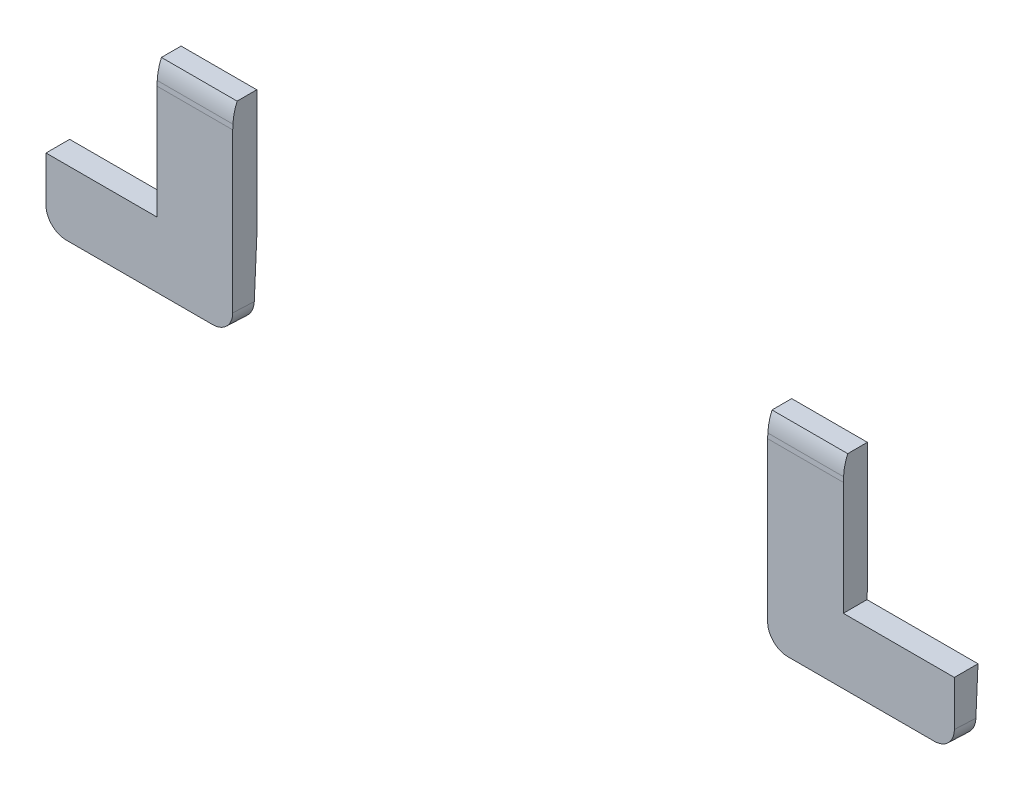
ISO-10303-21;
HEADER;
FILE_DESCRIPTION(('STEP AP214'),'2;1');
FILE_NAME('part.step','',(''),(''),'','','');
FILE_SCHEMA(('AUTOMOTIVE_DESIGN { 1 0 10303 214 1 1 1 1 }'));
ENDSEC;
DATA;
#1=APPLICATION_CONTEXT('core data for automotive mechanical design processes');
#2=APPLICATION_PROTOCOL_DEFINITION('international standard','automotive_design',2000,#1);
#3=PRODUCT_CONTEXT('',#1,'mechanical');
#4=PRODUCT('Part','Part','',(#3));
#5=PRODUCT_RELATED_PRODUCT_CATEGORY('part','',(#4));
#6=PRODUCT_DEFINITION_FORMATION('','',#4);
#7=PRODUCT_DEFINITION_CONTEXT('part definition',#1,'design');
#8=PRODUCT_DEFINITION('design','',#6,#7);
#9=PRODUCT_DEFINITION_SHAPE('','',#8);
#10=(LENGTH_UNIT() NAMED_UNIT(*) SI_UNIT(.MILLI.,.METRE.));
#11=(NAMED_UNIT(*) PLANE_ANGLE_UNIT() SI_UNIT($,.RADIAN.));
#12=(NAMED_UNIT(*) SI_UNIT($,.STERADIAN.) SOLID_ANGLE_UNIT());
#13=UNCERTAINTY_MEASURE_WITH_UNIT(LENGTH_MEASURE(1.E-05),#10,'distance_accuracy_value','');
#14=(GEOMETRIC_REPRESENTATION_CONTEXT(3) GLOBAL_UNCERTAINTY_ASSIGNED_CONTEXT((#13)) GLOBAL_UNIT_ASSIGNED_CONTEXT((#10,
#11,#12)) REPRESENTATION_CONTEXT('',''));
#15=CARTESIAN_POINT('',(0.,0.,0.));
#16=DIRECTION('',(0.,0.,1.));
#17=DIRECTION('',(1.,0.,0.));
#18=AXIS2_PLACEMENT_3D('',#15,#16,#17);
#19=CARTESIAN_POINT('',(-0.004529647218293,0.945256113519,1.630794230925));
#20=DIRECTION('',(0.,0.,1.));
#21=DIRECTION('',(1.,0.,0.));
#22=AXIS2_PLACEMENT_3D('',#19,#20,#21);
#23=PLANE('',#22);
#24=DIRECTION('',(1.,0.,0.));
#25=VECTOR('',#24,1.);
#26=CARTESIAN_POINT('',(-1.7,0.869994434825,1.630794232952));
#27=LINE('',#26,#25);
#28=CARTESIAN_POINT('',(-1.700000000121,0.869994434488,1.630794230925));
#29=VERTEX_POINT('',#28);
#30=CARTESIAN_POINT('',(-1.325,0.86999443497,1.630794233823));
#31=VERTEX_POINT('',#30);
#32=EDGE_CURVE('P0_E220',#29,#31,#27,.T.);
#33=ORIENTED_EDGE('',*,*,#32,.F.);
#34=DIRECTION('',(0.,1.,0.));
#35=VECTOR('',#34,1.);
#36=CARTESIAN_POINT('',(-1.700000000121,0.693878056689,1.630794230925));
#37=LINE('',#36,#35);
#38=CARTESIAN_POINT('',(-1.700000000121,1.5,1.630794230925));
#39=VERTEX_POINT('',#38);
#40=EDGE_CURVE('P0_E118',#29,#39,#37,.T.);
#41=ORIENTED_EDGE('',*,*,#40,.T.);
#42=DIRECTION('',(1.,0.,0.));
#43=VECTOR('',#42,1.);
#44=CARTESIAN_POINT('',(0.722735176391,1.5,1.630794230925));
#45=LINE('',#44,#43);
#46=CARTESIAN_POINT('',(-1.325,1.5,1.630794230925));
#47=VERTEX_POINT('',#46);
#48=EDGE_CURVE('P0_E204',#39,#47,#45,.T.);
#49=ORIENTED_EDGE('',*,*,#48,.T.);
#50=DIRECTION('',(0.,-1.,0.));
#51=VECTOR('',#50,1.);
#52=CARTESIAN_POINT('',(-1.325,1.305636250759,1.630794230925));
#53=LINE('',#52,#51);
#54=EDGE_CURVE('P0_E215',#47,#31,#53,.T.);
#55=ORIENTED_EDGE('',*,*,#54,.T.);
#56=EDGE_LOOP('',(#33,#41,#49,#55));
#57=FACE_BOUND('',#56,.T.);
#58=ADVANCED_FACE('P0_F16',(#57),#23,.F.);
#59=CARTESIAN_POINT('',(-2.391207098215,0.825845048784,1.75));
#60=DIRECTION('',(0.,1.,0.));
#61=DIRECTION('',(1.,0.,0.));
#62=AXIS2_PLACEMENT_3D('',#59,#60,#61);
#63=PLANE('',#62);
#64=DIRECTION('',(0.,0.,1.));
#65=VECTOR('',#64,1.);
#66=CARTESIAN_POINT('',(-2.25,0.825845048784,1.6988636365));
#67=LINE('',#66,#65);
#68=CARTESIAN_POINT('',(-2.25,0.825845048784,1.632801024034));
#69=VERTEX_POINT('',#68);
#70=CARTESIAN_POINT('',(-2.25,0.825845048784,1.75));
#71=VERTEX_POINT('',#70);
#72=EDGE_CURVE('P0_E11',#69,#71,#67,.T.);
#73=ORIENTED_EDGE('',*,*,#72,.T.);
#74=DIRECTION('',(1.,0.,0.));
#75=VECTOR('',#74,1.);
#76=CARTESIAN_POINT('',(-2.370603549108,0.825845048784,1.75));
#77=LINE('',#76,#75);
#78=CARTESIAN_POINT('',(-1.700000000121,0.825845048784,1.75));
#79=VERTEX_POINT('',#78);
#80=EDGE_CURVE('P0_E166',#71,#79,#77,.T.);
#81=ORIENTED_EDGE('',*,*,#80,.T.);
#82=DIRECTION('',(0.,0.,1.));
#83=VECTOR('',#82,1.);
#84=CARTESIAN_POINT('',(-1.700000000121,0.825845048784,1.75));
#85=LINE('',#84,#83);
#86=CARTESIAN_POINT('',(-1.700000000121,0.825845048784,1.632801024034));
#87=VERTEX_POINT('',#86);
#88=EDGE_CURVE('P0_E152',#87,#79,#85,.T.);
#89=ORIENTED_EDGE('',*,*,#88,.F.);
#90=DIRECTION('',(-1.,0.,0.));
#91=VECTOR('',#90,1.);
#92=CARTESIAN_POINT('',(-1.858103549108,0.825845048784,1.632801024034));
#93=LINE('',#92,#91);
#94=EDGE_CURVE('P0_E235',#87,#69,#93,.T.);
#95=ORIENTED_EDGE('',*,*,#94,.T.);
#96=EDGE_LOOP('',(#73,#81,#89,#95));
#97=FACE_BOUND('',#96,.T.);
#98=ADVANCED_FACE('P0_F167',(#97),#63,.T.);
#99=CARTESIAN_POINT('',(-2.25,0.49746756,1.647727273));
#100=DIRECTION('',(1.,0.,0.));
#101=DIRECTION('',(0.,0.,1.));
#102=AXIS2_PLACEMENT_3D('',#99,#100,#101);
#103=PLANE('',#102);
#104=ORIENTED_EDGE('',*,*,#72,.F.);
#105=DIRECTION('',(0.,0.998968540282601,-0.0454076593280119));
#106=VECTOR('',#105,1.);
#107=CARTESIAN_POINT('',(-2.25,0.49746756,1.647727273));
#108=LINE('',#107,#106);
#109=CARTESIAN_POINT('',(-2.25,0.597364413256,1.643186507102));
#110=VERTEX_POINT('',#109);
#111=EDGE_CURVE('P0_E27',#110,#69,#108,.T.);
#112=ORIENTED_EDGE('',*,*,#111,.F.);
#113=DIRECTION('',(0.,0.0454076593280119,0.998968540282601));
#114=VECTOR('',#113,1.);
#115=CARTESIAN_POINT('',(-2.25,0.597364413256,1.643186507102));
#116=LINE('',#115,#114);
#117=CARTESIAN_POINT('',(-2.25,0.602219571853,1.75));
#118=VERTEX_POINT('',#117);
#119=EDGE_CURVE('P0_E243',#110,#118,#116,.T.);
#120=ORIENTED_EDGE('',*,*,#119,.T.);
#121=DIRECTION('',(0.,1.,0.));
#122=VECTOR('',#121,1.);
#123=CARTESIAN_POINT('',(-2.25,0.668095740128,1.75));
#124=LINE('',#123,#122);
#125=EDGE_CURVE('P0_E170',#118,#71,#124,.T.);
#126=ORIENTED_EDGE('',*,*,#125,.T.);
#127=EDGE_LOOP('',(#104,#112,#120,#126));
#128=FACE_BOUND('',#127,.T.);
#129=ADVANCED_FACE('P0_F329',(#128),#103,.F.);
#130=CARTESIAN_POINT('',(-1.325,0.49746756,1.647727273));
#131=DIRECTION('',(0.,0.0454076593280119,0.998968540282601));
#132=DIRECTION('',(1.,0.,0.));
#133=AXIS2_PLACEMENT_3D('',#130,#131,#132);
#134=PLANE('',#133);
#135=ORIENTED_EDGE('',*,*,#94,.F.);
#136=DIRECTION('',(0.,-0.998968540282601,0.0454076593280119));
#137=VECTOR('',#136,1.);
#138=CARTESIAN_POINT('',(-1.700000000121,0.467720859972,1.649079395681));
#139=LINE('',#138,#137);
#140=EDGE_CURVE('P0_E159',#29,#87,#139,.T.);
#141=ORIENTED_EDGE('',*,*,#140,.F.);
#142=ORIENTED_EDGE('',*,*,#32,.T.);
#143=DIRECTION('',(0.,0.998968540282601,-0.0454076593280119));
#144=VECTOR('',#143,1.);
#145=CARTESIAN_POINT('',(-1.325,0.49746756,1.647727273));
#146=LINE('',#145,#144);
#147=CARTESIAN_POINT('',(-1.325,0.597364413256,1.643186507102));
#148=VERTEX_POINT('',#147);
#149=EDGE_CURVE('P0_E84',#148,#31,#146,.T.);
#150=ORIENTED_EDGE('',*,*,#149,.F.);
#151=CARTESIAN_POINT('',(-1.424999999226,0.597364413256,1.643186507102));
#152=DIRECTION('',(0.,-0.0454076593280117,-0.998968540282601));
#153=DIRECTION('',(0.,-0.998968540282601,0.0454076593280117));
#154=AXIS2_PLACEMENT_3D('',#151,#152,#153);
#155=CIRCLE('',#154,0.09999999922649);
#156=CARTESIAN_POINT('',(-1.424999999226,0.49746756,1.647727273));
#157=VERTEX_POINT('',#156);
#158=EDGE_CURVE('P0_E143',#148,#157,#155,.T.);
#159=ORIENTED_EDGE('',*,*,#158,.T.);
#160=DIRECTION('',(1.,0.,0.));
#161=VECTOR('',#160,1.);
#162=CARTESIAN_POINT('',(-1.325,0.49746756,1.647727273));
#163=LINE('',#162,#161);
#164=CARTESIAN_POINT('',(-2.150000000774,0.49746756,1.647727273));
#165=VERTEX_POINT('',#164);
#166=EDGE_CURVE('P0_E184',#165,#157,#163,.T.);
#167=ORIENTED_EDGE('',*,*,#166,.F.);
#168=CARTESIAN_POINT('',(-2.150000000774,0.597364413256,1.643186507102));
#169=DIRECTION('',(0.,-0.0454076593280117,-0.998968540282601));
#170=DIRECTION('',(0.,-0.998968540282601,0.0454076593280117));
#171=AXIS2_PLACEMENT_3D('',#168,#169,#170);
#172=CIRCLE('',#171,0.09999999922649);
#173=EDGE_CURVE('P0_E239',#165,#110,#172,.T.);
#174=ORIENTED_EDGE('',*,*,#173,.T.);
#175=ORIENTED_EDGE('',*,*,#111,.T.);
#176=EDGE_LOOP('',(#135,#141,#142,#150,#159,#167,#174,#175));
#177=FACE_BOUND('',#176,.T.);
#178=ADVANCED_FACE('P0_F296',(#177),#134,.F.);
#179=CARTESIAN_POINT('',(1.325,1.363023706,1.751119625));
#180=DIRECTION('',(0.,0.0454076614461347,0.998968540186323));
#181=DIRECTION('',(1.,0.,0.));
#182=AXIS2_PLACEMENT_3D('',#179,#180,#181);
#183=PLANE('',#182);
#184=DIRECTION('',(1.,0.,0.));
#185=VECTOR('',#184,1.);
#186=CARTESIAN_POINT('',(-0.501966381464,1.387655455713,1.75));
#187=LINE('',#186,#185);
#188=CARTESIAN_POINT('',(-1.699999999587,1.387655455713,1.75));
#189=VERTEX_POINT('',#188);
#190=CARTESIAN_POINT('',(-1.325,1.387655455713,1.75));
#191=VERTEX_POINT('',#190);
#192=EDGE_CURVE('P0_E175',#189,#191,#187,.T.);
#193=ORIENTED_EDGE('',*,*,#192,.T.);
#194=DIRECTION('',(0.,0.998968540186323,-0.0454076614461347));
#195=VECTOR('',#194,1.);
#196=CARTESIAN_POINT('',(-1.325,1.363023706,1.751119625));
#197=LINE('',#196,#195);
#198=CARTESIAN_POINT('',(-1.325,1.411408062362,1.748920336049));
#199=VERTEX_POINT('',#198);
#200=EDGE_CURVE('P0_E98',#191,#199,#197,.T.);
#201=ORIENTED_EDGE('',*,*,#200,.T.);
#202=DIRECTION('',(-1.,0.,0.));
#203=VECTOR('',#202,1.);
#204=CARTESIAN_POINT('',(1.325,1.411408062362,1.748920336049));
#205=LINE('',#204,#203);
#206=CARTESIAN_POINT('',(-1.699999999587,1.411408062362,1.748920336049));
#207=VERTEX_POINT('',#206);
#208=EDGE_CURVE('P0_E163',#199,#207,#205,.T.);
#209=ORIENTED_EDGE('',*,*,#208,.T.);
#210=DIRECTION('',(0.,-0.998968540186323,0.0454076614461347));
#211=VECTOR('',#210,1.);
#212=CARTESIAN_POINT('',(-1.699999999587,1.363023706,1.751119625));
#213=LINE('',#212,#211);
#214=EDGE_CURVE('P0_E20',#207,#189,#213,.T.);
#215=ORIENTED_EDGE('',*,*,#214,.T.);
#216=EDGE_LOOP('',(#193,#201,#209,#215));
#217=FACE_BOUND('',#216,.T.);
#218=ADVANCED_FACE('P0_F18',(#217),#183,.T.);
#219=CARTESIAN_POINT('',(-1.325,1.666016388,1.55));
#220=DIRECTION('',(1.,0.,0.));
#221=DIRECTION('',(0.,1.,0.));
#222=AXIS2_PLACEMENT_3D('',#219,#220,#221);
#223=PLANE('',#222);
#224=ORIENTED_EDGE('',*,*,#54,.F.);
#225=DIRECTION('',(0.,0.,1.));
#226=VECTOR('',#225,1.);
#227=CARTESIAN_POINT('',(-1.325,1.5,0.655278002348));
#228=LINE('',#227,#226);
#229=CARTESIAN_POINT('',(-1.325,1.5,1.728331482121));
#230=VERTEX_POINT('',#229);
#231=EDGE_CURVE('P0_E192',#47,#230,#228,.T.);
#232=ORIENTED_EDGE('',*,*,#231,.T.);
#233=CARTESIAN_POINT('',(-1.325,1.400056147,1.499178201002));
#234=DIRECTION('',(1.,0.,0.));
#235=DIRECTION('',(0.,0.,-1.));
#236=AXIS2_PLACEMENT_3D('',#233,#234,#235);
#237=CIRCLE('',#236,0.25);
#238=EDGE_CURVE('P0_E218',#230,#199,#237,.T.);
#239=ORIENTED_EDGE('',*,*,#238,.T.);
#240=ORIENTED_EDGE('',*,*,#200,.F.);
#241=DIRECTION('',(0.,-1.,0.));
#242=VECTOR('',#241,1.);
#243=CARTESIAN_POINT('',(-1.325,1.252370154128,1.75));
#244=LINE('',#243,#242);
#245=CARTESIAN_POINT('',(-1.325,0.602219571853,1.75));
#246=VERTEX_POINT('',#245);
#247=EDGE_CURVE('P0_E210',#191,#246,#244,.T.);
#248=ORIENTED_EDGE('',*,*,#247,.T.);
#249=DIRECTION('',(0.,-0.0454076593280119,-0.998968540282601));
#250=VECTOR('',#249,1.);
#251=CARTESIAN_POINT('',(-1.325,0.597364413256,1.643186507102));
#252=LINE('',#251,#250);
#253=EDGE_CURVE('P0_E248',#246,#148,#252,.T.);
#254=ORIENTED_EDGE('',*,*,#253,.T.);
#255=ORIENTED_EDGE('',*,*,#149,.T.);
#256=EDGE_LOOP('',(#224,#232,#239,#240,#248,#254,#255));
#257=FACE_BOUND('',#256,.T.);
#258=ADVANCED_FACE('P0_F278',(#257),#223,.T.);
#259=CARTESIAN_POINT('',(-1.424999999226,0.603839027256,1.785628020102));
#260=DIRECTION('',(0.,-0.0454076593280117,-0.998968540282601));
#261=DIRECTION('',(0.,0.998968540282601,-0.0454076593280117));
#262=AXIS2_PLACEMENT_3D('',#259,#260,#261);
#263=CYLINDRICAL_SURFACE('',#262,0.09999999922649);
#264=CARTESIAN_POINT('',(-1.325,0.602219571853,1.75));
#265=CARTESIAN_POINT('',(-1.32499999999951,0.543580444645959,1.75));
#266=CARTESIAN_POINT('',(-1.36642135591642,0.502116320155,1.75));
#267=CARTESIAN_POINT('',(-1.424999999226,0.502116320155,1.75));
#268=(BOUNDED_CURVE() B_SPLINE_CURVE(3,(#264,#265,#266,#267),.UNSPECIFIED.,.F.,
.F.) B_SPLINE_CURVE_WITH_KNOTS((4,4),(1.5707963267949,3.1415926535898),
.UNSPECIFIED.) CURVE() GEOMETRIC_REPRESENTATION_ITEM() RATIONAL_B_SPLINE_CURVE((1.,
0.804737854124365,0.804737854124365,1.)) REPRESENTATION_ITEM(''));
#269=CARTESIAN_POINT('',(-1.424999999226,0.502116320155,1.75));
#270=VERTEX_POINT('',#269);
#271=EDGE_CURVE('P0_E188',#246,#270,#268,.T.);
#272=ORIENTED_EDGE('',*,*,#271,.T.);
#273=DIRECTION('',(0.,0.0454076593280119,0.998968540282601));
#274=VECTOR('',#273,1.);
#275=CARTESIAN_POINT('',(-1.424999999226,0.503942174,1.790168786));
#276=LINE('',#275,#274);
#277=EDGE_CURVE('P0_E177',#157,#270,#276,.T.);
#278=ORIENTED_EDGE('',*,*,#277,.F.);
#279=ORIENTED_EDGE('',*,*,#158,.F.);
#280=ORIENTED_EDGE('',*,*,#253,.F.);
#281=EDGE_LOOP('',(#272,#278,#279,#280));
#282=FACE_BOUND('',#281,.T.);
#283=ADVANCED_FACE('P0_F281',(#282),#263,.T.);
#284=CARTESIAN_POINT('',(1.325,1.400056147,1.499178201002));
#285=DIRECTION('',(-1.,0.,0.));
#286=DIRECTION('',(0.,0.,1.));
#287=AXIS2_PLACEMENT_3D('',#284,#285,#286);
#288=CYLINDRICAL_SURFACE('',#287,0.25);
#289=DIRECTION('',(-1.,0.,0.));
#290=VECTOR('',#289,1.);
#291=CARTESIAN_POINT('',(1.325,1.5,1.728331482121));
#292=LINE('',#291,#290);
#293=CARTESIAN_POINT('',(-1.7,1.5,1.728331482121));
#294=VERTEX_POINT('',#293);
#295=EDGE_CURVE('P0_E195',#230,#294,#292,.T.);
#296=ORIENTED_EDGE('',*,*,#295,.T.);
#297=CARTESIAN_POINT('',(-1.7,1.400056147,1.499178201002));
#298=DIRECTION('',(-1.,0.,0.));
#299=DIRECTION('',(0.,0.,-1.));
#300=AXIS2_PLACEMENT_3D('',#297,#298,#299);
#301=CIRCLE('',#300,0.25);
#302=EDGE_CURVE('P0_E225',#207,#294,#301,.T.);
#303=ORIENTED_EDGE('',*,*,#302,.F.);
#304=ORIENTED_EDGE('',*,*,#208,.F.);
#305=ORIENTED_EDGE('',*,*,#238,.F.);
#306=EDGE_LOOP('',(#296,#303,#304,#305));
#307=FACE_BOUND('',#306,.T.);
#308=ADVANCED_FACE('P0_F339',(#307),#288,.T.);
#309=CARTESIAN_POINT('',(-1.7,1.499999999739,1.521793619773));
#310=DIRECTION('',(1.,0.,0.));
#311=DIRECTION('',(0.,1.,0.));
#312=AXIS2_PLACEMENT_3D('',#309,#310,#311);
#313=PLANE('',#312);
#314=DIRECTION('',(0.,1.,0.));
#315=VECTOR('',#314,1.);
#316=CARTESIAN_POINT('',(-1.7,1.169361959998,1.75));
#317=LINE('',#316,#315);
#318=EDGE_CURVE('P0_E157',#79,#189,#317,.T.);
#319=ORIENTED_EDGE('',*,*,#318,.T.);
#320=ORIENTED_EDGE('',*,*,#214,.F.);
#321=ORIENTED_EDGE('',*,*,#302,.T.);
#322=DIRECTION('',(0.,0.,-1.));
#323=VECTOR('',#322,1.);
#324=CARTESIAN_POINT('',(-1.7,1.5,0.641174812234));
#325=LINE('',#324,#323);
#326=EDGE_CURVE('P0_E206',#294,#39,#325,.T.);
#327=ORIENTED_EDGE('',*,*,#326,.T.);
#328=ORIENTED_EDGE('',*,*,#40,.F.);
#329=ORIENTED_EDGE('',*,*,#140,.T.);
#330=ORIENTED_EDGE('',*,*,#88,.T.);
#331=EDGE_LOOP('',(#319,#320,#321,#327,#328,#329,#330));
#332=FACE_BOUND('',#331,.T.);
#333=ADVANCED_FACE('P0_F154',(#332),#313,.F.);
#334=CARTESIAN_POINT('',(1.45,1.5,-1.6));
#335=DIRECTION('',(0.,1.,0.));
#336=DIRECTION('',(1.,0.,0.));
#337=AXIS2_PLACEMENT_3D('',#334,#335,#336);
#338=PLANE('',#337);
#339=ORIENTED_EDGE('',*,*,#48,.F.);
#340=ORIENTED_EDGE('',*,*,#326,.F.);
#341=ORIENTED_EDGE('',*,*,#295,.F.);
#342=ORIENTED_EDGE('',*,*,#231,.F.);
#343=EDGE_LOOP('',(#339,#340,#341,#342));
#344=FACE_BOUND('',#343,.T.);
#345=ADVANCED_FACE('P0_F277',(#344),#338,.T.);
#346=CARTESIAN_POINT('',(-2.35,0.9,1.75));
#347=DIRECTION('',(0.,0.,1.));
#348=DIRECTION('',(1.,0.,0.));
#349=AXIS2_PLACEMENT_3D('',#346,#347,#348);
#350=PLANE('',#349);
#351=ORIENTED_EDGE('',*,*,#318,.F.);
#352=ORIENTED_EDGE('',*,*,#80,.F.);
#353=ORIENTED_EDGE('',*,*,#125,.F.);
#354=CARTESIAN_POINT('',(-2.150000000774,0.502116320155,1.75));
#355=CARTESIAN_POINT('',(-2.20857864408358,0.502116320155,1.75));
#356=CARTESIAN_POINT('',(-2.25000000000049,0.543580444645959,1.75));
#357=CARTESIAN_POINT('',(-2.25,0.602219571853,1.75));
#358=(BOUNDED_CURVE() B_SPLINE_CURVE(3,(#354,#355,#356,#357),.UNSPECIFIED.,.F.,
.F.) B_SPLINE_CURVE_WITH_KNOTS((4,4),(3.1415926535898,4.71238898038469),
.UNSPECIFIED.) CURVE() GEOMETRIC_REPRESENTATION_ITEM() RATIONAL_B_SPLINE_CURVE((1.,
0.804737854124365,0.804737854124365,1.)) REPRESENTATION_ITEM(''));
#359=CARTESIAN_POINT('',(-2.150000000774,0.502116320155,1.75));
#360=VERTEX_POINT('',#359);
#361=EDGE_CURVE('P0_E247',#360,#118,#358,.T.);
#362=ORIENTED_EDGE('',*,*,#361,.F.);
#363=DIRECTION('',(-1.,0.,0.));
#364=VECTOR('',#363,1.);
#365=CARTESIAN_POINT('',(-2.289466381464,0.502116320155,1.75));
#366=LINE('',#365,#364);
#367=EDGE_CURVE('P0_E199',#270,#360,#366,.T.);
#368=ORIENTED_EDGE('',*,*,#367,.F.);
#369=ORIENTED_EDGE('',*,*,#271,.F.);
#370=ORIENTED_EDGE('',*,*,#247,.F.);
#371=ORIENTED_EDGE('',*,*,#192,.F.);
#372=EDGE_LOOP('',(#351,#352,#353,#362,#368,#369,#370,#371));
#373=FACE_BOUND('',#372,.T.);
#374=ADVANCED_FACE('P0_F173',(#373),#350,.T.);
#375=CARTESIAN_POINT('',(-2.25,0.503942174,1.790168786));
#376=DIRECTION('',(0.,0.998968540282601,-0.0454076593280119));
#377=DIRECTION('',(-1.,0.,0.));
#378=AXIS2_PLACEMENT_3D('',#375,#376,#377);
#379=PLANE('',#378);
#380=ORIENTED_EDGE('',*,*,#367,.T.);
#381=DIRECTION('',(0.,-0.0454076593280119,-0.998968540282601));
#382=VECTOR('',#381,1.);
#383=CARTESIAN_POINT('',(-2.150000000774,0.503942174,1.790168786));
#384=LINE('',#383,#382);
#385=EDGE_CURVE('P0_E203',#360,#165,#384,.T.);
#386=ORIENTED_EDGE('',*,*,#385,.T.);
#387=ORIENTED_EDGE('',*,*,#166,.T.);
#388=ORIENTED_EDGE('',*,*,#277,.T.);
#389=EDGE_LOOP('',(#380,#386,#387,#388));
#390=FACE_BOUND('',#389,.T.);
#391=ADVANCED_FACE('P0_F285',(#390),#379,.F.);
#392=CARTESIAN_POINT('',(-2.150000000774,0.603839027256,1.785628020102));
#393=DIRECTION('',(0.,-0.0454076593280117,-0.998968540282601));
#394=DIRECTION('',(0.,0.998968540282601,-0.0454076593280117));
#395=AXIS2_PLACEMENT_3D('',#392,#393,#394);
#396=CYLINDRICAL_SURFACE('',#395,0.09999999922649);
#397=ORIENTED_EDGE('',*,*,#361,.T.);
#398=ORIENTED_EDGE('',*,*,#119,.F.);
#399=ORIENTED_EDGE('',*,*,#173,.F.);
#400=ORIENTED_EDGE('',*,*,#385,.F.);
#401=EDGE_LOOP('',(#397,#398,#399,#400));
#402=FACE_BOUND('',#401,.T.);
#403=ADVANCED_FACE('P0_F365',(#402),#396,.T.);
#404=CLOSED_SHELL('',(#58,#98,#129,#178,#218,#258,#283,#308,#333,#345,#374,#391,#403));
#405=MANIFOLD_SOLID_BREP('P0_B1',#404);
#406=CARTESIAN_POINT('',(1.325,1.400056147,1.499178201002));
#407=DIRECTION('',(-1.,0.,0.));
#408=DIRECTION('',(0.,0.,1.));
#409=AXIS2_PLACEMENT_3D('',#406,#407,#408);
#410=CYLINDRICAL_SURFACE('',#409,0.25);
#411=DIRECTION('',(-1.,0.,0.));
#412=VECTOR('',#411,1.);
#413=CARTESIAN_POINT('',(1.325,1.5,1.728331482121));
#414=LINE('',#413,#412);
#415=CARTESIAN_POINT('',(1.7,1.5,1.728331482121));
#416=VERTEX_POINT('',#415);
#417=CARTESIAN_POINT('',(1.325,1.5,1.728331482121));
#418=VERTEX_POINT('',#417);
#419=EDGE_CURVE('P1_E169',#416,#418,#414,.T.);
#420=ORIENTED_EDGE('',*,*,#419,.T.);
#421=CARTESIAN_POINT('',(1.325,1.400056147,1.499178201002));
#422=DIRECTION('',(-1.,0.,0.));
#423=DIRECTION('',(0.,0.,1.));
#424=AXIS2_PLACEMENT_3D('',#421,#422,#423);
#425=CIRCLE('',#424,0.25);
#426=CARTESIAN_POINT('',(1.325000000125,1.411408062362,1.748920336049));
#427=VERTEX_POINT('',#426);
#428=EDGE_CURVE('P1_E202',#427,#418,#425,.T.);
#429=ORIENTED_EDGE('',*,*,#428,.F.);
#430=DIRECTION('',(-1.,0.,0.));
#431=VECTOR('',#430,1.);
#432=CARTESIAN_POINT('',(1.325,1.411408062362,1.748920336049));
#433=LINE('',#432,#431);
#434=CARTESIAN_POINT('',(1.7,1.411408062386,1.748920336591));
#435=VERTEX_POINT('',#434);
#436=EDGE_CURVE('P1_E196',#435,#427,#433,.T.);
#437=ORIENTED_EDGE('',*,*,#436,.F.);
#438=CARTESIAN_POINT('',(1.7,1.400056147,1.499178201002));
#439=DIRECTION('',(1.,0.,0.));
#440=DIRECTION('',(0.,0.,-1.));
#441=AXIS2_PLACEMENT_3D('',#438,#439,#440);
#442=CIRCLE('',#441,0.25);
#443=EDGE_CURVE('P1_E145',#416,#435,#442,.T.);
#444=ORIENTED_EDGE('',*,*,#443,.F.);
#445=EDGE_LOOP('',(#420,#429,#437,#444));
#446=FACE_BOUND('',#445,.T.);
#447=ADVANCED_FACE('P1_F16',(#446),#410,.T.);
#448=CARTESIAN_POINT('',(1.424999999226,0.603839027256,1.785628020102));
#449=DIRECTION('',(0.,0.0454076593280117,0.998968540282601));
#450=DIRECTION('',(0.,-0.998968540282601,0.0454076593280117));
#451=AXIS2_PLACEMENT_3D('',#448,#449,#450);
#452=CYLINDRICAL_SURFACE('',#451,0.09999999922649);
#453=CARTESIAN_POINT('',(1.424999999226,0.502116320155,1.75));
#454=CARTESIAN_POINT('',(1.36642135591642,0.502116320155,1.75));
#455=CARTESIAN_POINT('',(1.32499999999951,0.543580444645959,1.75));
#456=CARTESIAN_POINT('',(1.325,0.602219571853,1.75));
#457=(BOUNDED_CURVE() B_SPLINE_CURVE(3,(#453,#454,#455,#456),.UNSPECIFIED.,.F.,
.F.) B_SPLINE_CURVE_WITH_KNOTS((4,4),(0.,1.5707963267949),
.UNSPECIFIED.) CURVE() GEOMETRIC_REPRESENTATION_ITEM() RATIONAL_B_SPLINE_CURVE((1.,
0.804737854124365,0.804737854124365,1.)) REPRESENTATION_ITEM(''));
#458=CARTESIAN_POINT('',(1.424999999226,0.502116320155,1.75));
#459=VERTEX_POINT('',#458);
#460=CARTESIAN_POINT('',(1.325,0.602219571853,1.75));
#461=VERTEX_POINT('',#460);
#462=EDGE_CURVE('P1_E11',#459,#461,#457,.T.);
#463=ORIENTED_EDGE('',*,*,#462,.T.);
#464=DIRECTION('',(0.,0.0454076593280119,0.998968540282601));
#465=VECTOR('',#464,1.);
#466=CARTESIAN_POINT('',(1.325,0.603839027256,1.785628020102));
#467=LINE('',#466,#465);
#468=CARTESIAN_POINT('',(1.325,0.597364413256,1.643186507102));
#469=VERTEX_POINT('',#468);
#470=EDGE_CURVE('P1_E186',#469,#461,#467,.T.);
#471=ORIENTED_EDGE('',*,*,#470,.F.);
#472=CARTESIAN_POINT('',(1.424999999226,0.597364413256,1.643186507102));
#473=DIRECTION('',(0.,-0.0454076593280117,-0.998968540282601));
#474=DIRECTION('',(0.,-0.998968540282601,0.0454076593280117));
#475=AXIS2_PLACEMENT_3D('',#472,#473,#474);
#476=CIRCLE('',#475,0.09999999922649);
#477=CARTESIAN_POINT('',(1.424999999226,0.49746756,1.647727273));
#478=VERTEX_POINT('',#477);
#479=EDGE_CURVE('P1_E240',#478,#469,#476,.T.);
#480=ORIENTED_EDGE('',*,*,#479,.F.);
#481=DIRECTION('',(0.,-0.0454076593280119,-0.998968540282601));
#482=VECTOR('',#481,1.);
#483=CARTESIAN_POINT('',(1.424999999226,0.49746756,1.647727273));
#484=LINE('',#483,#482);
#485=EDGE_CURVE('P1_E27',#459,#478,#484,.T.);
#486=ORIENTED_EDGE('',*,*,#485,.F.);
#487=EDGE_LOOP('',(#463,#471,#480,#486));
#488=FACE_BOUND('',#487,.T.);
#489=ADVANCED_FACE('P1_F425',(#488),#452,.T.);
#490=CARTESIAN_POINT('',(2.35,1.24,1.75));
#491=DIRECTION('',(0.,0.,1.));
#492=DIRECTION('',(1.,0.,0.));
#493=AXIS2_PLACEMENT_3D('',#490,#491,#492);
#494=PLANE('',#493);
#495=DIRECTION('',(0.,-1.,0.));
#496=VECTOR('',#495,1.);
#497=CARTESIAN_POINT('',(1.7,0.944702956164,1.75));
#498=LINE('',#497,#496);
#499=CARTESIAN_POINT('',(1.7,1.387655489873,1.75));
#500=VERTEX_POINT('',#499);
#501=CARTESIAN_POINT('',(1.700000000251,0.825845048784,1.75));
#502=VERTEX_POINT('',#501);
#503=EDGE_CURVE('P1_E134',#500,#502,#498,.T.);
#504=ORIENTED_EDGE('',*,*,#503,.F.);
#505=DIRECTION('',(1.,0.,0.));
#506=VECTOR('',#505,1.);
#507=CARTESIAN_POINT('',(1.620829202549,1.387655455713,1.75));
#508=LINE('',#507,#506);
#509=CARTESIAN_POINT('',(1.325000000125,1.387655455713,1.75));
#510=VERTEX_POINT('',#509);
#511=EDGE_CURVE('P1_E194',#510,#500,#508,.T.);
#512=ORIENTED_EDGE('',*,*,#511,.F.);
#513=DIRECTION('',(0.,1.,0.));
#514=VECTOR('',#513,1.);
#515=CARTESIAN_POINT('',(1.325,0.795130297368,1.75));
#516=LINE('',#515,#514);
#517=EDGE_CURVE('P1_E181',#461,#510,#516,.T.);
#518=ORIENTED_EDGE('',*,*,#517,.F.);
#519=ORIENTED_EDGE('',*,*,#462,.F.);
#520=DIRECTION('',(-1.,0.,0.));
#521=VECTOR('',#520,1.);
#522=CARTESIAN_POINT('',(1.620829202549,0.502116320155,1.75));
#523=LINE('',#522,#521);
#524=CARTESIAN_POINT('',(2.150000000707,0.502116320155,1.75));
#525=VERTEX_POINT('',#524);
#526=EDGE_CURVE('P1_E144',#525,#459,#523,.T.);
#527=ORIENTED_EDGE('',*,*,#526,.F.);
#528=CARTESIAN_POINT('',(2.249999999933,0.602219571853,1.75));
#529=CARTESIAN_POINT('',(2.24999999993349,0.543580444645959,1.75));
#530=CARTESIAN_POINT('',(2.20857864401658,0.502116320155,1.75));
#531=CARTESIAN_POINT('',(2.150000000707,0.502116320155,1.75));
#532=(BOUNDED_CURVE() B_SPLINE_CURVE(3,(#528,#529,#530,#531),.UNSPECIFIED.,.F.,
.F.) B_SPLINE_CURVE_WITH_KNOTS((4,4),(4.71238898038469,6.28318530717959),
.UNSPECIFIED.) CURVE() GEOMETRIC_REPRESENTATION_ITEM() RATIONAL_B_SPLINE_CURVE((1.,
0.804737854124365,0.804737854124365,1.)) REPRESENTATION_ITEM(''));
#533=CARTESIAN_POINT('',(2.249999999933,0.602219571853,1.75));
#534=VERTEX_POINT('',#533);
#535=EDGE_CURVE('P1_E195',#534,#525,#532,.T.);
#536=ORIENTED_EDGE('',*,*,#535,.F.);
#537=DIRECTION('',(0.,-1.,0.));
#538=VECTOR('',#537,1.);
#539=CARTESIAN_POINT('',(2.249999999933,0.9464373606,1.75));
#540=LINE('',#539,#538);
#541=CARTESIAN_POINT('',(2.249999999933,0.825845048784,1.75));
#542=VERTEX_POINT('',#541);
#543=EDGE_CURVE('P1_E150',#542,#534,#540,.T.);
#544=ORIENTED_EDGE('',*,*,#543,.F.);
#545=DIRECTION('',(1.,0.,0.));
#546=VECTOR('',#545,1.);
#547=CARTESIAN_POINT('',(1.8375,0.825845048784,1.75));
#548=LINE('',#547,#546);
#549=EDGE_CURVE('P1_E148',#502,#542,#548,.T.);
#550=ORIENTED_EDGE('',*,*,#549,.F.);
#551=EDGE_LOOP('',(#504,#512,#518,#519,#527,#536,#544,#550));
#552=FACE_BOUND('',#551,.T.);
#553=ADVANCED_FACE('P1_F149',(#552),#494,.T.);
#554=CARTESIAN_POINT('',(1.325,0.503942174,1.790168786));
#555=DIRECTION('',(0.,0.998968540282601,-0.0454076593280119));
#556=DIRECTION('',(-1.,0.,0.));
#557=AXIS2_PLACEMENT_3D('',#554,#555,#556);
#558=PLANE('',#557);
#559=ORIENTED_EDGE('',*,*,#526,.T.);
#560=ORIENTED_EDGE('',*,*,#485,.T.);
#561=DIRECTION('',(1.,0.,0.));
#562=VECTOR('',#561,1.);
#563=CARTESIAN_POINT('',(2.350000000067,0.49746756,1.647727273));
#564=LINE('',#563,#562);
#565=CARTESIAN_POINT('',(2.150000000707,0.49746756,1.647727273));
#566=VERTEX_POINT('',#565);
#567=EDGE_CURVE('P1_E20',#478,#566,#564,.T.);
#568=ORIENTED_EDGE('',*,*,#567,.T.);
#569=DIRECTION('',(0.,0.0454076593280119,0.998968540282601));
#570=VECTOR('',#569,1.);
#571=CARTESIAN_POINT('',(2.150000000707,0.503942174,1.790168786));
#572=LINE('',#571,#570);
#573=EDGE_CURVE('P1_E89',#566,#525,#572,.T.);
#574=ORIENTED_EDGE('',*,*,#573,.T.);
#575=EDGE_LOOP('',(#559,#560,#568,#574));
#576=FACE_BOUND('',#575,.T.);
#577=ADVANCED_FACE('P1_F435',(#576),#558,.F.);
#578=CARTESIAN_POINT('',(1.7,0.890136061593,1.751643990777));
#579=DIRECTION('',(1.,0.,0.));
#580=DIRECTION('',(0.,1.,0.));
#581=AXIS2_PLACEMENT_3D('',#578,#579,#580);
#582=PLANE('',#581);
#583=DIRECTION('',(0.,-1.,0.));
#584=VECTOR('',#583,1.);
#585=CARTESIAN_POINT('',(1.7,0.917696087556,1.630794230925));
#586=LINE('',#585,#584);
#587=CARTESIAN_POINT('',(1.700000000251,1.5,1.630794230925));
#588=VERTEX_POINT('',#587);
#589=CARTESIAN_POINT('',(1.7,0.869994434908,1.630794233144));
#590=VERTEX_POINT('',#589);
#591=EDGE_CURVE('P1_E166',#588,#590,#586,.T.);
#592=ORIENTED_EDGE('',*,*,#591,.F.);
#593=DIRECTION('',(0.,0.,1.));
#594=VECTOR('',#593,1.);
#595=CARTESIAN_POINT('',(1.7,1.5,0.756099997736));
#596=LINE('',#595,#594);
#597=EDGE_CURVE('P1_E219',#588,#416,#596,.T.);
#598=ORIENTED_EDGE('',*,*,#597,.T.);
#599=ORIENTED_EDGE('',*,*,#443,.T.);
#600=DIRECTION('',(0.,-0.998968540330515,0.0454076582739179));
#601=VECTOR('',#600,1.);
#602=CARTESIAN_POINT('',(1.7,1.387655469911,1.750000000907));
#603=LINE('',#602,#601);
#604=EDGE_CURVE('P1_E141',#435,#500,#603,.T.);
#605=ORIENTED_EDGE('',*,*,#604,.T.);
#606=ORIENTED_EDGE('',*,*,#503,.T.);
#607=DIRECTION('',(0.,0.,-1.));
#608=VECTOR('',#607,1.);
#609=CARTESIAN_POINT('',(1.700000000251,0.825845048784,1.75));
#610=LINE('',#609,#608);
#611=CARTESIAN_POINT('',(1.700000000251,0.825845048784,1.632801024034));
#612=VERTEX_POINT('',#611);
#613=EDGE_CURVE('P1_E138',#502,#612,#610,.T.);
#614=ORIENTED_EDGE('',*,*,#613,.T.);
#615=DIRECTION('',(0.,0.998968540282601,-0.0454076593280119));
#616=VECTOR('',#615,1.);
#617=CARTESIAN_POINT('',(1.700000000251,0.995380653933,1.625094860434));
#618=LINE('',#617,#616);
#619=EDGE_CURVE('P1_E191',#612,#590,#618,.T.);
#620=ORIENTED_EDGE('',*,*,#619,.T.);
#621=EDGE_LOOP('',(#592,#598,#599,#605,#606,#614,#620));
#622=FACE_BOUND('',#621,.T.);
#623=ADVANCED_FACE('P1_F18',(#622),#582,.T.);
#624=CARTESIAN_POINT('',(1.325,1.363023706,1.751119625));
#625=DIRECTION('',(0.,0.0454076614461347,0.998968540186323));
#626=DIRECTION('',(1.,0.,0.));
#627=AXIS2_PLACEMENT_3D('',#624,#625,#626);
#628=PLANE('',#627);
#629=ORIENTED_EDGE('',*,*,#511,.T.);
#630=ORIENTED_EDGE('',*,*,#604,.F.);
#631=ORIENTED_EDGE('',*,*,#436,.T.);
#632=DIRECTION('',(0.,-0.998968540186323,0.0454076614461347));
#633=VECTOR('',#632,1.);
#634=CARTESIAN_POINT('',(1.325000000125,1.363023706,1.751119625));
#635=LINE('',#634,#633);
#636=EDGE_CURVE('P1_E185',#427,#510,#635,.T.);
#637=ORIENTED_EDGE('',*,*,#636,.T.);
#638=EDGE_LOOP('',(#629,#630,#631,#637));
#639=FACE_BOUND('',#638,.T.);
#640=ADVANCED_FACE('P1_F441',(#639),#628,.T.);
#641=CARTESIAN_POINT('',(2.150000000707,0.603839027218,1.785628019276));
#642=DIRECTION('',(0.,0.0454076593280117,0.998968540282601));
#643=DIRECTION('',(0.,-0.998968540282601,0.0454076593280117));
#644=AXIS2_PLACEMENT_3D('',#641,#642,#643);
#645=CYLINDRICAL_SURFACE('',#644,0.09999999922649);
#646=ORIENTED_EDGE('',*,*,#535,.T.);
#647=ORIENTED_EDGE('',*,*,#573,.F.);
#648=CARTESIAN_POINT('',(2.150000000707,0.597364413256,1.643186507102));
#649=DIRECTION('',(0.,-0.0454076593280117,-0.998968540282601));
#650=DIRECTION('',(0.,-0.998968540282601,0.0454076593280117));
#651=AXIS2_PLACEMENT_3D('',#648,#649,#650);
#652=CIRCLE('',#651,0.09999999922649);
#653=CARTESIAN_POINT('',(2.249999999933,0.597364413242,1.643186506805));
#654=VERTEX_POINT('',#653);
#655=EDGE_CURVE('P1_E190',#654,#566,#652,.T.);
#656=ORIENTED_EDGE('',*,*,#655,.F.);
#657=DIRECTION('',(0.,-0.0454076593280119,-0.998968540282601));
#658=VECTOR('',#657,1.);
#659=CARTESIAN_POINT('',(2.249999999933,0.597364413252,1.643186507016));
#660=LINE('',#659,#658);
#661=EDGE_CURVE('P1_E105',#534,#654,#660,.T.);
#662=ORIENTED_EDGE('',*,*,#661,.F.);
#663=EDGE_LOOP('',(#646,#647,#656,#662));
#664=FACE_BOUND('',#663,.T.);
#665=ADVANCED_FACE('P1_F437',(#664),#645,.T.);
#666=CARTESIAN_POINT('',(2.249999999933,0.893604870463,1.772456845046));
#667=DIRECTION('',(1.,0.,0.));
#668=DIRECTION('',(0.,1.,0.));
#669=AXIS2_PLACEMENT_3D('',#666,#667,#668);
#670=PLANE('',#669);
#671=DIRECTION('',(0.,0.,-1.));
#672=VECTOR('',#671,1.);
#673=CARTESIAN_POINT('',(2.249999999933,0.825845048784,1.761228422523));
#674=LINE('',#673,#672);
#675=CARTESIAN_POINT('',(2.249999999933,0.825845048784,1.63280102325));
#676=VERTEX_POINT('',#675);
#677=EDGE_CURVE('P1_E155',#542,#676,#674,.T.);
#678=ORIENTED_EDGE('',*,*,#677,.F.);
#679=ORIENTED_EDGE('',*,*,#543,.T.);
#680=ORIENTED_EDGE('',*,*,#661,.T.);
#681=DIRECTION('',(0.,0.998968540186323,-0.0454076614461347));
#682=VECTOR('',#681,1.);
#683=CARTESIAN_POINT('',(2.249999999933,0.497467559694,1.647727272928));
#684=LINE('',#683,#682);
#685=EDGE_CURVE('P1_E187',#654,#676,#684,.T.);
#686=ORIENTED_EDGE('',*,*,#685,.T.);
#687=EDGE_LOOP('',(#678,#679,#680,#686));
#688=FACE_BOUND('',#687,.T.);
#689=ADVANCED_FACE('P1_F420',(#688),#670,.T.);
#690=CARTESIAN_POINT('',(2.350000000067,0.49746756,1.647727273));
#691=DIRECTION('',(0.,0.0454076593280119,0.998968540282601));
#692=DIRECTION('',(1.,0.,0.));
#693=AXIS2_PLACEMENT_3D('',#690,#691,#692);
#694=PLANE('',#693);
#695=DIRECTION('',(-1.,0.,0.));
#696=VECTOR('',#695,1.);
#697=CARTESIAN_POINT('',(1.172735176424,0.869994498724,1.630794230925));
#698=LINE('',#697,#696);
#699=CARTESIAN_POINT('',(1.325,0.869994498724,1.630794230925));
#700=VERTEX_POINT('',#699);
#701=EDGE_CURVE('P1_E177',#590,#700,#698,.T.);
#702=ORIENTED_EDGE('',*,*,#701,.F.);
#703=ORIENTED_EDGE('',*,*,#619,.F.);
#704=DIRECTION('',(-1.,0.,0.));
#705=VECTOR('',#704,1.);
#706=CARTESIAN_POINT('',(1.837500000033,0.825845048784,1.632801024034));
#707=LINE('',#706,#705);
#708=EDGE_CURVE('P1_E159',#676,#612,#707,.T.);
#709=ORIENTED_EDGE('',*,*,#708,.F.);
#710=ORIENTED_EDGE('',*,*,#685,.F.);
#711=ORIENTED_EDGE('',*,*,#655,.T.);
#712=ORIENTED_EDGE('',*,*,#567,.F.);
#713=ORIENTED_EDGE('',*,*,#479,.T.);
#714=DIRECTION('',(0.,0.998968540282601,-0.0454076593280119));
#715=VECTOR('',#714,1.);
#716=CARTESIAN_POINT('',(1.325,0.49746756,1.647727273));
#717=LINE('',#716,#715);
#718=EDGE_CURVE('P1_E216',#469,#700,#717,.T.);
#719=ORIENTED_EDGE('',*,*,#718,.T.);
#720=EDGE_LOOP('',(#702,#703,#709,#710,#711,#712,#713,#719));
#721=FACE_BOUND('',#720,.T.);
#722=ADVANCED_FACE('P1_F407',(#721),#694,.F.);
#723=CARTESIAN_POINT('',(1.325,0.590990744,1.55));
#724=DIRECTION('',(-1.,0.,0.));
#725=DIRECTION('',(0.,0.,1.));
#726=AXIS2_PLACEMENT_3D('',#723,#724,#725);
#727=PLANE('',#726);
#728=DIRECTION('',(0.,1.,0.));
#729=VECTOR('',#728,1.);
#730=CARTESIAN_POINT('',(1.325,0.768123428759,1.630794230925));
#731=LINE('',#730,#729);
#732=CARTESIAN_POINT('',(1.325,1.5,1.630794230925));
#733=VERTEX_POINT('',#732);
#734=EDGE_CURVE('P1_E172',#700,#733,#731,.T.);
#735=ORIENTED_EDGE('',*,*,#734,.F.);
#736=ORIENTED_EDGE('',*,*,#718,.F.);
#737=ORIENTED_EDGE('',*,*,#470,.T.);
#738=ORIENTED_EDGE('',*,*,#517,.T.);
#739=ORIENTED_EDGE('',*,*,#636,.F.);
#740=ORIENTED_EDGE('',*,*,#428,.T.);
#741=DIRECTION('',(0.,0.,-1.));
#742=VECTOR('',#741,1.);
#743=CARTESIAN_POINT('',(1.325,1.5,0.655278002348));
#744=LINE('',#743,#742);
#745=EDGE_CURVE('P1_E180',#418,#733,#744,.T.);
#746=ORIENTED_EDGE('',*,*,#745,.T.);
#747=EDGE_LOOP('',(#735,#736,#737,#738,#739,#740,#746));
#748=FACE_BOUND('',#747,.T.);
#749=ADVANCED_FACE('P1_F411',(#748),#727,.T.);
#750=CARTESIAN_POINT('',(1.45,1.5,-1.6));
#751=DIRECTION('',(0.,1.,0.));
#752=DIRECTION('',(1.,0.,0.));
#753=AXIS2_PLACEMENT_3D('',#750,#751,#752);
#754=PLANE('',#753);
#755=DIRECTION('',(1.,0.,0.));
#756=VECTOR('',#755,1.);
#757=CARTESIAN_POINT('',(0.722735176391,1.5,1.630794230925));
#758=LINE('',#757,#756);
#759=EDGE_CURVE('P1_E176',#733,#588,#758,.T.);
#760=ORIENTED_EDGE('',*,*,#759,.F.);
#761=ORIENTED_EDGE('',*,*,#745,.F.);
#762=ORIENTED_EDGE('',*,*,#419,.F.);
#763=ORIENTED_EDGE('',*,*,#597,.F.);
#764=EDGE_LOOP('',(#760,#761,#762,#763));
#765=FACE_BOUND('',#764,.T.);
#766=ADVANCED_FACE('P1_F396',(#765),#754,.T.);
#767=CARTESIAN_POINT('',(1.325,0.825845048784,1.75));
#768=DIRECTION('',(0.,1.,0.));
#769=DIRECTION('',(1.,0.,0.));
#770=AXIS2_PLACEMENT_3D('',#767,#768,#769);
#771=PLANE('',#770);
#772=ORIENTED_EDGE('',*,*,#708,.T.);
#773=ORIENTED_EDGE('',*,*,#613,.F.);
#774=ORIENTED_EDGE('',*,*,#549,.T.);
#775=ORIENTED_EDGE('',*,*,#677,.T.);
#776=EDGE_LOOP('',(#772,#773,#774,#775));
#777=FACE_BOUND('',#776,.T.);
#778=ADVANCED_FACE('P1_F157',(#777),#771,.T.);
#779=CARTESIAN_POINT('',(-0.004529647218293,0.945256113519,1.630794230925));
#780=DIRECTION('',(0.,0.,1.));
#781=DIRECTION('',(1.,0.,0.));
#782=AXIS2_PLACEMENT_3D('',#779,#780,#781);
#783=PLANE('',#782);
#784=ORIENTED_EDGE('',*,*,#701,.T.);
#785=ORIENTED_EDGE('',*,*,#734,.T.);
#786=ORIENTED_EDGE('',*,*,#759,.T.);
#787=ORIENTED_EDGE('',*,*,#591,.T.);
#788=EDGE_LOOP('',(#784,#785,#786,#787));
#789=FACE_BOUND('',#788,.T.);
#790=ADVANCED_FACE('P1_F391',(#789),#783,.F.);
#791=CLOSED_SHELL('',(#447,#489,#553,#577,#623,#640,#665,#689,#722,#749,#766,#778,#790));
#792=MANIFOLD_SOLID_BREP('P1_B1',#791);
#793=ADVANCED_BREP_SHAPE_REPRESENTATION('',(#18,#405,#792),#14);
#794=SHAPE_DEFINITION_REPRESENTATION(#9,#793);
ENDSEC;
END-ISO-10303-21;
